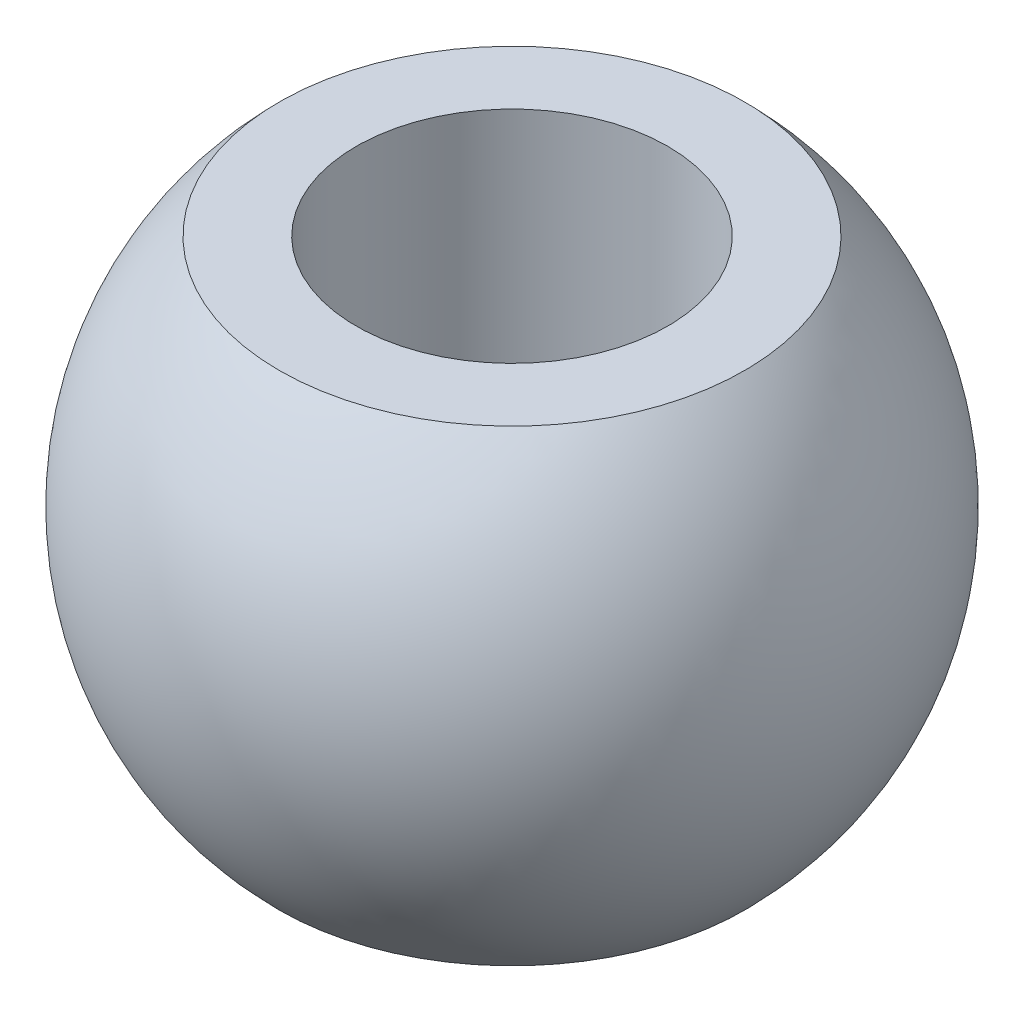
ISO-10303-21;
HEADER;
FILE_DESCRIPTION(('STEP AP214'),'2;1');
FILE_NAME('part.step','',(''),(''),'','','');
FILE_SCHEMA(('AUTOMOTIVE_DESIGN { 1 0 10303 214 1 1 1 1 }'));
ENDSEC;
DATA;
#1=APPLICATION_CONTEXT('core data for automotive mechanical design processes');
#2=APPLICATION_PROTOCOL_DEFINITION('international standard','automotive_design',2000,#1);
#3=PRODUCT_CONTEXT('',#1,'mechanical');
#4=PRODUCT('Part','Part','',(#3));
#5=PRODUCT_RELATED_PRODUCT_CATEGORY('part','',(#4));
#6=PRODUCT_DEFINITION_FORMATION('','',#4);
#7=PRODUCT_DEFINITION_CONTEXT('part definition',#1,'design');
#8=PRODUCT_DEFINITION('design','',#6,#7);
#9=PRODUCT_DEFINITION_SHAPE('','',#8);
#10=(LENGTH_UNIT() NAMED_UNIT(*) SI_UNIT(.MILLI.,.METRE.));
#11=(NAMED_UNIT(*) PLANE_ANGLE_UNIT() SI_UNIT($,.RADIAN.));
#12=(NAMED_UNIT(*) SI_UNIT($,.STERADIAN.) SOLID_ANGLE_UNIT());
#13=UNCERTAINTY_MEASURE_WITH_UNIT(LENGTH_MEASURE(1.E-05),#10,'distance_accuracy_value','');
#14=(GEOMETRIC_REPRESENTATION_CONTEXT(3) GLOBAL_UNCERTAINTY_ASSIGNED_CONTEXT((#13)) GLOBAL_UNIT_ASSIGNED_CONTEXT((#10,
#11,#12)) REPRESENTATION_CONTEXT('',''));
#15=CARTESIAN_POINT('',(0.,0.,0.));
#16=DIRECTION('',(0.,0.,1.));
#17=DIRECTION('',(1.,0.,0.));
#18=AXIS2_PLACEMENT_3D('',#15,#16,#17);
#19=CARTESIAN_POINT('',(0.,0.,0.));
#20=DIRECTION('',(0.,-1.,0.));
#21=DIRECTION('',(0.,0.,-1.));
#22=AXIS2_PLACEMENT_3D('',#19,#20,#21);
#23=CYLINDRICAL_SURFACE('',#22,3.);
#24=CARTESIAN_POINT('',(0.,-4.5,0.));
#25=DIRECTION('',(0.,-1.,0.));
#26=DIRECTION('',(0.,0.,-1.));
#27=AXIS2_PLACEMENT_3D('',#24,#25,#26);
#28=CIRCLE('',#27,3.);
#29=CARTESIAN_POINT('',(0.,-4.5,-3.));
#30=VERTEX_POINT('',#29);
#31=EDGE_CURVE('E26',#30,#30,#28,.F.);
#32=ORIENTED_EDGE('',*,*,#31,.F.);
#33=EDGE_LOOP('',(#32));
#34=FACE_BOUND('',#33,.T.);
#35=CARTESIAN_POINT('',(0.,4.5,0.));
#36=DIRECTION('',(0.,-1.,0.));
#37=DIRECTION('',(0.,0.,-1.));
#38=AXIS2_PLACEMENT_3D('',#35,#36,#37);
#39=CIRCLE('',#38,3.);
#40=CARTESIAN_POINT('',(0.,4.5,-3.));
#41=VERTEX_POINT('',#40);
#42=EDGE_CURVE('E17',#41,#41,#39,.T.);
#43=ORIENTED_EDGE('',*,*,#42,.F.);
#44=EDGE_LOOP('',(#43));
#45=FACE_BOUND('',#44,.T.);
#46=ADVANCED_FACE('F14',(#34,#45),#23,.F.);
#47=CARTESIAN_POINT('',(0.,4.5,0.));
#48=DIRECTION('',(0.,1.,0.));
#49=DIRECTION('',(0.,0.,1.));
#50=AXIS2_PLACEMENT_3D('',#47,#48,#49);
#51=PLANE('',#50);
#52=ORIENTED_EDGE('',*,*,#42,.T.);
#53=EDGE_LOOP('',(#52));
#54=FACE_BOUND('',#53,.T.);
#55=CARTESIAN_POINT('',(0.,4.5,0.));
#56=DIRECTION('',(0.,1.,0.));
#57=DIRECTION('',(0.,0.,1.));
#58=AXIS2_PLACEMENT_3D('',#55,#56,#57);
#59=CIRCLE('',#58,4.48023436886956);
#60=CARTESIAN_POINT('',(0.,4.5,4.48023436886956));
#61=VERTEX_POINT('',#60);
#62=EDGE_CURVE('E21',#61,#61,#59,.F.);
#63=ORIENTED_EDGE('',*,*,#62,.F.);
#64=EDGE_LOOP('',(#63));
#65=FACE_BOUND('',#64,.T.);
#66=ADVANCED_FACE('F36',(#54,#65),#51,.T.);
#67=CARTESIAN_POINT('',(0.,-4.5,0.));
#68=DIRECTION('',(0.,-1.,0.));
#69=DIRECTION('',(0.,0.,-1.));
#70=AXIS2_PLACEMENT_3D('',#67,#68,#69);
#71=PLANE('',#70);
#72=ORIENTED_EDGE('',*,*,#31,.T.);
#73=EDGE_LOOP('',(#72));
#74=FACE_BOUND('',#73,.T.);
#75=CARTESIAN_POINT('',(0.,-4.5,0.));
#76=DIRECTION('',(0.,1.,0.));
#77=DIRECTION('',(0.,0.,1.));
#78=AXIS2_PLACEMENT_3D('',#75,#76,#77);
#79=CIRCLE('',#78,4.48023436886956);
#80=CARTESIAN_POINT('',(0.,-4.5,4.48023436886956));
#81=VERTEX_POINT('',#80);
#82=EDGE_CURVE('E10',#81,#81,#79,.T.);
#83=ORIENTED_EDGE('',*,*,#82,.F.);
#84=EDGE_LOOP('',(#83));
#85=FACE_BOUND('',#84,.T.);
#86=ADVANCED_FACE('F45',(#74,#85),#71,.T.);
#87=CARTESIAN_POINT('',(0.,0.,0.));
#88=DIRECTION('',(0.,1.,0.));
#89=DIRECTION('',(-1.,0.,0.));
#90=AXIS2_PLACEMENT_3D('',#87,#88,#89);
#91=SPHERICAL_SURFACE('',#90,6.35);
#92=ORIENTED_EDGE('',*,*,#62,.T.);
#93=EDGE_LOOP('',(#92));
#94=FACE_BOUND('',#93,.T.);
#95=ORIENTED_EDGE('',*,*,#82,.T.);
#96=EDGE_LOOP('',(#95));
#97=FACE_BOUND('',#96,.T.);
#98=ADVANCED_FACE('F46',(#94,#97),#91,.T.);
#99=CLOSED_SHELL('',(#46,#66,#86,#98));
#100=MANIFOLD_SOLID_BREP('B1',#99);
#101=ADVANCED_BREP_SHAPE_REPRESENTATION('',(#18,#100),#14);
#102=SHAPE_DEFINITION_REPRESENTATION(#9,#101);
ENDSEC;
END-ISO-10303-21;
